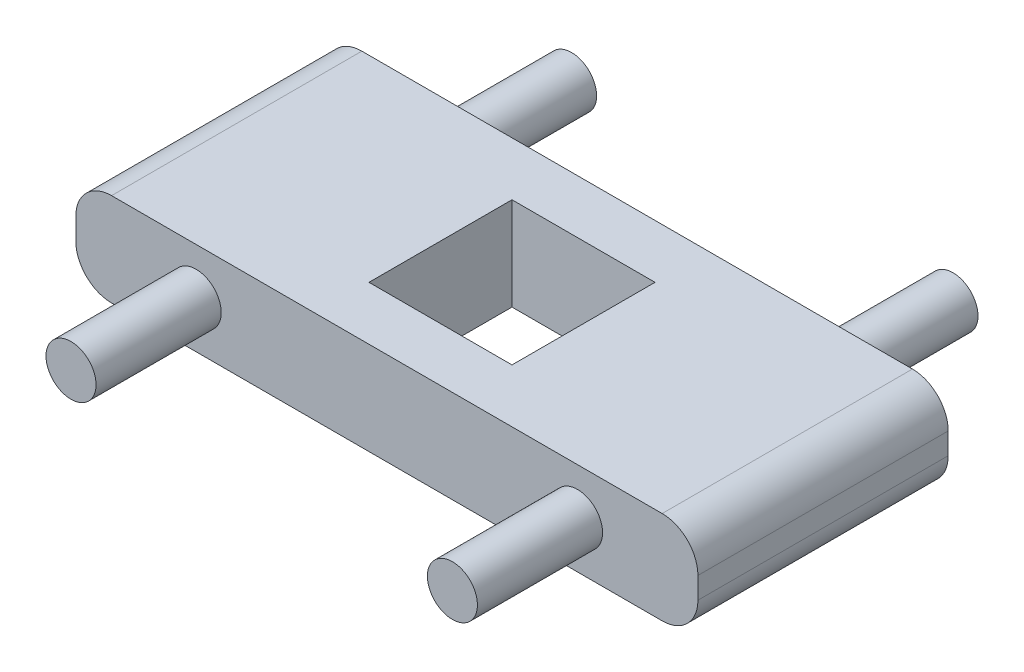
ISO-10303-21;
HEADER;
FILE_DESCRIPTION(('STEP AP214'),'2;1');
FILE_NAME('part.step','',(''),(''),'','','');
FILE_SCHEMA(('AUTOMOTIVE_DESIGN { 1 0 10303 214 1 1 1 1 }'));
ENDSEC;
DATA;
#1=APPLICATION_CONTEXT('core data for automotive mechanical design processes');
#2=APPLICATION_PROTOCOL_DEFINITION('international standard','automotive_design',2000,#1);
#3=PRODUCT_CONTEXT('',#1,'mechanical');
#4=PRODUCT('Part','Part','',(#3));
#5=PRODUCT_RELATED_PRODUCT_CATEGORY('part','',(#4));
#6=PRODUCT_DEFINITION_FORMATION('','',#4);
#7=PRODUCT_DEFINITION_CONTEXT('part definition',#1,'design');
#8=PRODUCT_DEFINITION('design','',#6,#7);
#9=PRODUCT_DEFINITION_SHAPE('','',#8);
#10=(LENGTH_UNIT() NAMED_UNIT(*) SI_UNIT(.MILLI.,.METRE.));
#11=(NAMED_UNIT(*) PLANE_ANGLE_UNIT() SI_UNIT($,.RADIAN.));
#12=(NAMED_UNIT(*) SI_UNIT($,.STERADIAN.) SOLID_ANGLE_UNIT());
#13=UNCERTAINTY_MEASURE_WITH_UNIT(LENGTH_MEASURE(1.E-05),#10,'distance_accuracy_value','');
#14=(GEOMETRIC_REPRESENTATION_CONTEXT(3) GLOBAL_UNCERTAINTY_ASSIGNED_CONTEXT((#13)) GLOBAL_UNIT_ASSIGNED_CONTEXT((#10,
#11,#12)) REPRESENTATION_CONTEXT('',''));
#15=CARTESIAN_POINT('',(0.,0.,0.));
#16=DIRECTION('',(0.,0.,1.));
#17=DIRECTION('',(1.,0.,0.));
#18=AXIS2_PLACEMENT_3D('',#15,#16,#17);
#19=CARTESIAN_POINT('',(0.,8.255,0.));
#20=DIRECTION('',(0.,-1.,0.));
#21=DIRECTION('',(0.,0.,-1.));
#22=AXIS2_PLACEMENT_3D('',#19,#20,#21);
#23=PLANE('',#22);
#24=DIRECTION('',(-1.,0.,0.));
#25=VECTOR('',#24,1.);
#26=CARTESIAN_POINT('',(-55.245,8.255,-22.225));
#27=LINE('',#26,#25);
#28=CARTESIAN_POINT('',(48.895,8.255,-22.225));
#29=VERTEX_POINT('',#28);
#30=CARTESIAN_POINT('',(-48.895,8.255,-22.225));
#31=VERTEX_POINT('',#30);
#32=EDGE_CURVE('E174',#29,#31,#27,.T.);
#33=ORIENTED_EDGE('',*,*,#32,.T.);
#34=DIRECTION('',(0.,0.,1.));
#35=VECTOR('',#34,1.);
#36=CARTESIAN_POINT('',(-48.895,8.255,0.));
#37=LINE('',#36,#35);
#38=CARTESIAN_POINT('',(-48.895,8.255,22.225));
#39=VERTEX_POINT('',#38);
#40=EDGE_CURVE('E222',#31,#39,#37,.T.);
#41=ORIENTED_EDGE('',*,*,#40,.T.);
#42=DIRECTION('',(1.,0.,0.));
#43=VECTOR('',#42,1.);
#44=CARTESIAN_POINT('',(-55.245,8.255,22.225));
#45=LINE('',#44,#43);
#46=CARTESIAN_POINT('',(48.895,8.255,22.225));
#47=VERTEX_POINT('',#46);
#48=EDGE_CURVE('E177',#39,#47,#45,.T.);
#49=ORIENTED_EDGE('',*,*,#48,.T.);
#50=DIRECTION('',(0.,0.,-1.));
#51=VECTOR('',#50,1.);
#52=CARTESIAN_POINT('',(48.895,8.255,0.));
#53=LINE('',#52,#51);
#54=EDGE_CURVE('E219',#47,#29,#53,.T.);
#55=ORIENTED_EDGE('',*,*,#54,.T.);
#56=EDGE_LOOP('',(#33,#41,#49,#55));
#57=FACE_BOUND('',#56,.T.);
#58=DIRECTION('',(0.,0.,1.));
#59=VECTOR('',#58,1.);
#60=CARTESIAN_POINT('',(-12.7,8.255,-12.7));
#61=LINE('',#60,#59);
#62=CARTESIAN_POINT('',(-12.7,8.255,-12.7));
#63=VERTEX_POINT('',#62);
#64=CARTESIAN_POINT('',(-12.7,8.255,12.7));
#65=VERTEX_POINT('',#64);
#66=EDGE_CURVE('E131',#63,#65,#61,.T.);
#67=ORIENTED_EDGE('',*,*,#66,.F.);
#68=DIRECTION('',(-1.,0.,0.));
#69=VECTOR('',#68,1.);
#70=CARTESIAN_POINT('',(12.7,8.255,-12.7));
#71=LINE('',#70,#69);
#72=CARTESIAN_POINT('',(12.7,8.255,-12.7));
#73=VERTEX_POINT('',#72);
#74=EDGE_CURVE('E156',#73,#63,#71,.T.);
#75=ORIENTED_EDGE('',*,*,#74,.F.);
#76=DIRECTION('',(0.,0.,-1.));
#77=VECTOR('',#76,1.);
#78=CARTESIAN_POINT('',(12.7,8.255,-12.7));
#79=LINE('',#78,#77);
#80=CARTESIAN_POINT('',(12.7,8.255,12.7));
#81=VERTEX_POINT('',#80);
#82=EDGE_CURVE('E154',#81,#73,#79,.T.);
#83=ORIENTED_EDGE('',*,*,#82,.F.);
#84=DIRECTION('',(1.,0.,0.));
#85=VECTOR('',#84,1.);
#86=CARTESIAN_POINT('',(12.7,8.255,12.7));
#87=LINE('',#86,#85);
#88=EDGE_CURVE('E141',#65,#81,#87,.T.);
#89=ORIENTED_EDGE('',*,*,#88,.F.);
#90=EDGE_LOOP('',(#67,#75,#83,#89));
#91=FACE_BOUND('',#90,.T.);
#92=ADVANCED_FACE('F39',(#57,#91),#23,.F.);
#93=CARTESIAN_POINT('',(0.,-8.255,0.));
#94=DIRECTION('',(0.,-1.,0.));
#95=DIRECTION('',(0.,0.,-1.));
#96=AXIS2_PLACEMENT_3D('',#93,#94,#95);
#97=PLANE('',#96);
#98=DIRECTION('',(1.,0.,0.));
#99=VECTOR('',#98,1.);
#100=CARTESIAN_POINT('',(-55.245,-8.255,22.225));
#101=LINE('',#100,#99);
#102=CARTESIAN_POINT('',(-48.895,-8.255,22.225));
#103=VERTEX_POINT('',#102);
#104=CARTESIAN_POINT('',(48.895,-8.255,22.225));
#105=VERTEX_POINT('',#104);
#106=EDGE_CURVE('E178',#103,#105,#101,.T.);
#107=ORIENTED_EDGE('',*,*,#106,.F.);
#108=DIRECTION('',(0.,0.,1.));
#109=VECTOR('',#108,1.);
#110=CARTESIAN_POINT('',(-48.895,-8.255,-22.225));
#111=LINE('',#110,#109);
#112=CARTESIAN_POINT('',(-48.895,-8.255,-22.225));
#113=VERTEX_POINT('',#112);
#114=EDGE_CURVE('E211',#103,#113,#111,.F.);
#115=ORIENTED_EDGE('',*,*,#114,.T.);
#116=DIRECTION('',(-1.,0.,0.));
#117=VECTOR('',#116,1.);
#118=CARTESIAN_POINT('',(-55.245,-8.255,-22.225));
#119=LINE('',#118,#117);
#120=CARTESIAN_POINT('',(48.895,-8.255,-22.225));
#121=VERTEX_POINT('',#120);
#122=EDGE_CURVE('E149',#121,#113,#119,.T.);
#123=ORIENTED_EDGE('',*,*,#122,.F.);
#124=DIRECTION('',(0.,0.,-1.));
#125=VECTOR('',#124,1.);
#126=CARTESIAN_POINT('',(48.895,-8.255,22.225));
#127=LINE('',#126,#125);
#128=EDGE_CURVE('E209',#121,#105,#127,.F.);
#129=ORIENTED_EDGE('',*,*,#128,.T.);
#130=EDGE_LOOP('',(#107,#115,#123,#129));
#131=FACE_BOUND('',#130,.T.);
#132=DIRECTION('',(-1.,0.,0.));
#133=VECTOR('',#132,1.);
#134=CARTESIAN_POINT('',(12.7,-8.255,-12.7));
#135=LINE('',#134,#133);
#136=CARTESIAN_POINT('',(12.7,-8.255,-12.7));
#137=VERTEX_POINT('',#136);
#138=CARTESIAN_POINT('',(-12.7,-8.255,-12.7));
#139=VERTEX_POINT('',#138);
#140=EDGE_CURVE('E142',#137,#139,#135,.T.);
#141=ORIENTED_EDGE('',*,*,#140,.T.);
#142=DIRECTION('',(0.,0.,1.));
#143=VECTOR('',#142,1.);
#144=CARTESIAN_POINT('',(-12.7,-8.255,-12.7));
#145=LINE('',#144,#143);
#146=CARTESIAN_POINT('',(-12.7,-8.255,12.7));
#147=VERTEX_POINT('',#146);
#148=EDGE_CURVE('E161',#139,#147,#145,.T.);
#149=ORIENTED_EDGE('',*,*,#148,.T.);
#150=DIRECTION('',(1.,0.,0.));
#151=VECTOR('',#150,1.);
#152=CARTESIAN_POINT('',(12.7,-8.255,12.7));
#153=LINE('',#152,#151);
#154=CARTESIAN_POINT('',(12.7,-8.255,12.7));
#155=VERTEX_POINT('',#154);
#156=EDGE_CURVE('E148',#147,#155,#153,.T.);
#157=ORIENTED_EDGE('',*,*,#156,.T.);
#158=DIRECTION('',(0.,0.,-1.));
#159=VECTOR('',#158,1.);
#160=CARTESIAN_POINT('',(12.7,-8.255,-12.7));
#161=LINE('',#160,#159);
#162=EDGE_CURVE('E165',#155,#137,#161,.T.);
#163=ORIENTED_EDGE('',*,*,#162,.T.);
#164=EDGE_LOOP('',(#141,#149,#157,#163));
#165=FACE_BOUND('',#164,.T.);
#166=ADVANCED_FACE('F273',(#131,#165),#97,.T.);
#167=CARTESIAN_POINT('',(55.245,8.255,22.225));
#168=DIRECTION('',(-1.,0.,0.));
#169=DIRECTION('',(0.,0.,1.));
#170=AXIS2_PLACEMENT_3D('',#167,#168,#169);
#171=PLANE('',#170);
#172=DIRECTION('',(0.,-1.,0.));
#173=VECTOR('',#172,1.);
#174=CARTESIAN_POINT('',(55.245,8.255,-22.225));
#175=LINE('',#174,#173);
#176=CARTESIAN_POINT('',(55.245,1.905,-22.225));
#177=VERTEX_POINT('',#176);
#178=CARTESIAN_POINT('',(55.245,-1.905,-22.225));
#179=VERTEX_POINT('',#178);
#180=EDGE_CURVE('E194',#177,#179,#175,.T.);
#181=ORIENTED_EDGE('',*,*,#180,.F.);
#182=DIRECTION('',(0.,0.,-1.));
#183=VECTOR('',#182,1.);
#184=CARTESIAN_POINT('',(55.245,1.905,22.225));
#185=LINE('',#184,#183);
#186=CARTESIAN_POINT('',(55.245,1.905,22.225));
#187=VERTEX_POINT('',#186);
#188=EDGE_CURVE('E227',#177,#187,#185,.F.);
#189=ORIENTED_EDGE('',*,*,#188,.T.);
#190=DIRECTION('',(0.,-1.,0.));
#191=VECTOR('',#190,1.);
#192=CARTESIAN_POINT('',(55.245,8.255,22.225));
#193=LINE('',#192,#191);
#194=CARTESIAN_POINT('',(55.245,-1.905,22.225));
#195=VERTEX_POINT('',#194);
#196=EDGE_CURVE('E181',#187,#195,#193,.T.);
#197=ORIENTED_EDGE('',*,*,#196,.T.);
#198=DIRECTION('',(0.,0.,-1.));
#199=VECTOR('',#198,1.);
#200=CARTESIAN_POINT('',(55.245,-1.905,-22.225));
#201=LINE('',#200,#199);
#202=EDGE_CURVE('E225',#195,#179,#201,.T.);
#203=ORIENTED_EDGE('',*,*,#202,.T.);
#204=EDGE_LOOP('',(#181,#189,#197,#203));
#205=FACE_BOUND('',#204,.T.);
#206=ADVANCED_FACE('F242',(#205),#171,.F.);
#207=CARTESIAN_POINT('',(-55.245,8.255,-22.225));
#208=DIRECTION('',(0.,0.,1.));
#209=DIRECTION('',(1.,0.,0.));
#210=AXIS2_PLACEMENT_3D('',#207,#208,#209);
#211=PLANE('',#210);
#212=CARTESIAN_POINT('',(-33.8666666666667,0.,-22.225));
#213=DIRECTION('',(0.,0.,1.));
#214=DIRECTION('',(1.,0.,0.));
#215=AXIS2_PLACEMENT_3D('',#212,#213,#214);
#216=CIRCLE('',#215,4.445);
#217=CARTESIAN_POINT('',(-29.4216666666667,0.,-22.225));
#218=VERTEX_POINT('',#217);
#219=EDGE_CURVE('E11',#218,#218,#216,.F.);
#220=ORIENTED_EDGE('',*,*,#219,.F.);
#221=EDGE_LOOP('',(#220));
#222=FACE_BOUND('',#221,.T.);
#223=CARTESIAN_POINT('',(33.8666666666667,0.,-22.225));
#224=DIRECTION('',(0.,0.,1.));
#225=DIRECTION('',(1.,0.,0.));
#226=AXIS2_PLACEMENT_3D('',#223,#224,#225);
#227=CIRCLE('',#226,4.445);
#228=CARTESIAN_POINT('',(38.3116666666667,0.,-22.225));
#229=VERTEX_POINT('',#228);
#230=EDGE_CURVE('E47',#229,#229,#227,.F.);
#231=ORIENTED_EDGE('',*,*,#230,.F.);
#232=EDGE_LOOP('',(#231));
#233=FACE_BOUND('',#232,.T.);
#234=ORIENTED_EDGE('',*,*,#122,.T.);
#235=CARTESIAN_POINT('',(-48.895,-1.905,-22.225));
#236=DIRECTION('',(0.,0.,1.));
#237=DIRECTION('',(1.,0.,0.));
#238=AXIS2_PLACEMENT_3D('',#235,#236,#237);
#239=CIRCLE('',#238,6.35);
#240=CARTESIAN_POINT('',(-55.245,-1.905,-22.225));
#241=VERTEX_POINT('',#240);
#242=EDGE_CURVE('E217',#113,#241,#239,.F.);
#243=ORIENTED_EDGE('',*,*,#242,.T.);
#244=DIRECTION('',(0.,-1.,0.));
#245=VECTOR('',#244,1.);
#246=CARTESIAN_POINT('',(-55.245,8.255,-22.225));
#247=LINE('',#246,#245);
#248=CARTESIAN_POINT('',(-55.245,1.905,-22.225));
#249=VERTEX_POINT('',#248);
#250=EDGE_CURVE('E191',#249,#241,#247,.T.);
#251=ORIENTED_EDGE('',*,*,#250,.F.);
#252=CARTESIAN_POINT('',(-48.895,1.905,-22.225));
#253=DIRECTION('',(0.,0.,1.));
#254=DIRECTION('',(1.,0.,0.));
#255=AXIS2_PLACEMENT_3D('',#252,#253,#254);
#256=CIRCLE('',#255,6.35);
#257=EDGE_CURVE('E215',#249,#31,#256,.F.);
#258=ORIENTED_EDGE('',*,*,#257,.T.);
#259=ORIENTED_EDGE('',*,*,#32,.F.);
#260=CARTESIAN_POINT('',(48.895,1.905,-22.225));
#261=DIRECTION('',(0.,0.,1.));
#262=DIRECTION('',(1.,0.,0.));
#263=AXIS2_PLACEMENT_3D('',#260,#261,#262);
#264=CIRCLE('',#263,6.35);
#265=EDGE_CURVE('E62',#29,#177,#264,.F.);
#266=ORIENTED_EDGE('',*,*,#265,.T.);
#267=ORIENTED_EDGE('',*,*,#180,.T.);
#268=CARTESIAN_POINT('',(48.895,-1.905,-22.225));
#269=DIRECTION('',(0.,0.,1.));
#270=DIRECTION('',(1.,0.,0.));
#271=AXIS2_PLACEMENT_3D('',#268,#269,#270);
#272=CIRCLE('',#271,6.35);
#273=EDGE_CURVE('E54',#179,#121,#272,.F.);
#274=ORIENTED_EDGE('',*,*,#273,.T.);
#275=EDGE_LOOP('',(#234,#243,#251,#258,#259,#266,#267,#274));
#276=FACE_BOUND('',#275,.T.);
#277=ADVANCED_FACE('F239',(#222,#233,#276),#211,.F.);
#278=CARTESIAN_POINT('',(-55.245,8.255,22.225));
#279=DIRECTION('',(1.,0.,0.));
#280=DIRECTION('',(0.,0.,-1.));
#281=AXIS2_PLACEMENT_3D('',#278,#279,#280);
#282=PLANE('',#281);
#283=ORIENTED_EDGE('',*,*,#250,.T.);
#284=DIRECTION('',(0.,0.,1.));
#285=VECTOR('',#284,1.);
#286=CARTESIAN_POINT('',(-55.245,-1.905,22.225));
#287=LINE('',#286,#285);
#288=CARTESIAN_POINT('',(-55.245,-1.905,22.225));
#289=VERTEX_POINT('',#288);
#290=EDGE_CURVE('E198',#241,#289,#287,.T.);
#291=ORIENTED_EDGE('',*,*,#290,.T.);
#292=DIRECTION('',(0.,-1.,0.));
#293=VECTOR('',#292,1.);
#294=CARTESIAN_POINT('',(-55.245,8.255,22.225));
#295=LINE('',#294,#293);
#296=CARTESIAN_POINT('',(-55.245,1.905,22.225));
#297=VERTEX_POINT('',#296);
#298=EDGE_CURVE('E188',#297,#289,#295,.T.);
#299=ORIENTED_EDGE('',*,*,#298,.F.);
#300=DIRECTION('',(0.,0.,1.));
#301=VECTOR('',#300,1.);
#302=CARTESIAN_POINT('',(-55.245,1.905,22.225));
#303=LINE('',#302,#301);
#304=EDGE_CURVE('E196',#297,#249,#303,.F.);
#305=ORIENTED_EDGE('',*,*,#304,.T.);
#306=EDGE_LOOP('',(#283,#291,#299,#305));
#307=FACE_BOUND('',#306,.T.);
#308=ADVANCED_FACE('F241',(#307),#282,.F.);
#309=CARTESIAN_POINT('',(-55.245,8.255,22.225));
#310=DIRECTION('',(0.,0.,-1.));
#311=DIRECTION('',(-1.,0.,0.));
#312=AXIS2_PLACEMENT_3D('',#309,#310,#311);
#313=PLANE('',#312);
#314=CARTESIAN_POINT('',(33.8666666666667,0.,22.225));
#315=DIRECTION('',(0.,0.,-1.));
#316=DIRECTION('',(-1.,0.,0.));
#317=AXIS2_PLACEMENT_3D('',#314,#315,#316);
#318=CIRCLE('',#317,4.445);
#319=CARTESIAN_POINT('',(29.4216666666667,0.,22.225));
#320=VERTEX_POINT('',#319);
#321=EDGE_CURVE('E232',#320,#320,#318,.F.);
#322=ORIENTED_EDGE('',*,*,#321,.F.);
#323=EDGE_LOOP('',(#322));
#324=FACE_BOUND('',#323,.T.);
#325=CARTESIAN_POINT('',(-33.8666666666667,0.,22.225));
#326=DIRECTION('',(0.,0.,-1.));
#327=DIRECTION('',(-1.,0.,0.));
#328=AXIS2_PLACEMENT_3D('',#325,#326,#327);
#329=CIRCLE('',#328,4.445);
#330=CARTESIAN_POINT('',(-38.3116666666667,0.,22.225));
#331=VERTEX_POINT('',#330);
#332=EDGE_CURVE('E229',#331,#331,#329,.F.);
#333=ORIENTED_EDGE('',*,*,#332,.F.);
#334=EDGE_LOOP('',(#333));
#335=FACE_BOUND('',#334,.T.);
#336=ORIENTED_EDGE('',*,*,#298,.T.);
#337=CARTESIAN_POINT('',(-48.895,-1.905,22.225));
#338=DIRECTION('',(0.,0.,-1.));
#339=DIRECTION('',(-1.,0.,0.));
#340=AXIS2_PLACEMENT_3D('',#337,#338,#339);
#341=CIRCLE('',#340,6.35);
#342=EDGE_CURVE('E207',#289,#103,#341,.F.);
#343=ORIENTED_EDGE('',*,*,#342,.T.);
#344=ORIENTED_EDGE('',*,*,#106,.T.);
#345=CARTESIAN_POINT('',(48.895,-1.905,22.225));
#346=DIRECTION('',(0.,0.,-1.));
#347=DIRECTION('',(-1.,0.,0.));
#348=AXIS2_PLACEMENT_3D('',#345,#346,#347);
#349=CIRCLE('',#348,6.35);
#350=EDGE_CURVE('E201',#105,#195,#349,.F.);
#351=ORIENTED_EDGE('',*,*,#350,.T.);
#352=ORIENTED_EDGE('',*,*,#196,.F.);
#353=CARTESIAN_POINT('',(48.895,1.905,22.225));
#354=DIRECTION('',(0.,0.,-1.));
#355=DIRECTION('',(-1.,0.,0.));
#356=AXIS2_PLACEMENT_3D('',#353,#354,#355);
#357=CIRCLE('',#356,6.35);
#358=EDGE_CURVE('E203',#187,#47,#357,.F.);
#359=ORIENTED_EDGE('',*,*,#358,.T.);
#360=ORIENTED_EDGE('',*,*,#48,.F.);
#361=CARTESIAN_POINT('',(-48.895,1.905,22.225));
#362=DIRECTION('',(0.,0.,-1.));
#363=DIRECTION('',(-1.,0.,0.));
#364=AXIS2_PLACEMENT_3D('',#361,#362,#363);
#365=CIRCLE('',#364,6.35);
#366=EDGE_CURVE('E205',#39,#297,#365,.F.);
#367=ORIENTED_EDGE('',*,*,#366,.T.);
#368=EDGE_LOOP('',(#336,#343,#344,#351,#352,#359,#360,#367));
#369=FACE_BOUND('',#368,.T.);
#370=ADVANCED_FACE('F257',(#324,#335,#369),#313,.F.);
#371=CARTESIAN_POINT('',(-12.7,8.255,-12.7));
#372=DIRECTION('',(1.,0.,0.));
#373=DIRECTION('',(0.,0.,-1.));
#374=AXIS2_PLACEMENT_3D('',#371,#372,#373);
#375=PLANE('',#374);
#376=ORIENTED_EDGE('',*,*,#148,.F.);
#377=DIRECTION('',(0.,-1.,0.));
#378=VECTOR('',#377,1.);
#379=CARTESIAN_POINT('',(-12.7,8.255,-12.7));
#380=LINE('',#379,#378);
#381=EDGE_CURVE('E137',#63,#139,#380,.T.);
#382=ORIENTED_EDGE('',*,*,#381,.F.);
#383=ORIENTED_EDGE('',*,*,#66,.T.);
#384=DIRECTION('',(0.,-1.,0.));
#385=VECTOR('',#384,1.);
#386=CARTESIAN_POINT('',(-12.7,8.255,12.7));
#387=LINE('',#386,#385);
#388=EDGE_CURVE('E134',#65,#147,#387,.T.);
#389=ORIENTED_EDGE('',*,*,#388,.T.);
#390=EDGE_LOOP('',(#376,#382,#383,#389));
#391=FACE_BOUND('',#390,.T.);
#392=ADVANCED_FACE('F133',(#391),#375,.T.);
#393=CARTESIAN_POINT('',(12.7,8.255,12.7));
#394=DIRECTION('',(0.,0.,-1.));
#395=DIRECTION('',(-1.,0.,0.));
#396=AXIS2_PLACEMENT_3D('',#393,#394,#395);
#397=PLANE('',#396);
#398=ORIENTED_EDGE('',*,*,#156,.F.);
#399=ORIENTED_EDGE('',*,*,#388,.F.);
#400=ORIENTED_EDGE('',*,*,#88,.T.);
#401=DIRECTION('',(0.,-1.,0.));
#402=VECTOR('',#401,1.);
#403=CARTESIAN_POINT('',(12.7,8.255,12.7));
#404=LINE('',#403,#402);
#405=EDGE_CURVE('E150',#81,#155,#404,.T.);
#406=ORIENTED_EDGE('',*,*,#405,.T.);
#407=EDGE_LOOP('',(#398,#399,#400,#406));
#408=FACE_BOUND('',#407,.T.);
#409=ADVANCED_FACE('F145',(#408),#397,.T.);
#410=CARTESIAN_POINT('',(12.7,8.255,-12.7));
#411=DIRECTION('',(-1.,0.,0.));
#412=DIRECTION('',(0.,0.,1.));
#413=AXIS2_PLACEMENT_3D('',#410,#411,#412);
#414=PLANE('',#413);
#415=ORIENTED_EDGE('',*,*,#162,.F.);
#416=ORIENTED_EDGE('',*,*,#405,.F.);
#417=ORIENTED_EDGE('',*,*,#82,.T.);
#418=DIRECTION('',(0.,-1.,0.));
#419=VECTOR('',#418,1.);
#420=CARTESIAN_POINT('',(12.7,8.255,-12.7));
#421=LINE('',#420,#419);
#422=EDGE_CURVE('E171',#73,#137,#421,.T.);
#423=ORIENTED_EDGE('',*,*,#422,.T.);
#424=EDGE_LOOP('',(#415,#416,#417,#423));
#425=FACE_BOUND('',#424,.T.);
#426=ADVANCED_FACE('F282',(#425),#414,.T.);
#427=CARTESIAN_POINT('',(12.7,8.255,-12.7));
#428=DIRECTION('',(0.,0.,1.));
#429=DIRECTION('',(1.,0.,0.));
#430=AXIS2_PLACEMENT_3D('',#427,#428,#429);
#431=PLANE('',#430);
#432=ORIENTED_EDGE('',*,*,#140,.F.);
#433=ORIENTED_EDGE('',*,*,#422,.F.);
#434=ORIENTED_EDGE('',*,*,#74,.T.);
#435=ORIENTED_EDGE('',*,*,#381,.T.);
#436=EDGE_LOOP('',(#432,#433,#434,#435));
#437=FACE_BOUND('',#436,.T.);
#438=ADVANCED_FACE('F280',(#437),#431,.T.);
#439=CARTESIAN_POINT('',(-48.895,-1.905,22.225));
#440=DIRECTION('',(0.,0.,-1.));
#441=DIRECTION('',(-1.,0.,0.));
#442=AXIS2_PLACEMENT_3D('',#439,#440,#441);
#443=CYLINDRICAL_SURFACE('',#442,6.35);
#444=ORIENTED_EDGE('',*,*,#242,.F.);
#445=ORIENTED_EDGE('',*,*,#114,.F.);
#446=ORIENTED_EDGE('',*,*,#342,.F.);
#447=ORIENTED_EDGE('',*,*,#290,.F.);
#448=EDGE_LOOP('',(#444,#445,#446,#447));
#449=FACE_BOUND('',#448,.T.);
#450=ADVANCED_FACE('F252',(#449),#443,.T.);
#451=CARTESIAN_POINT('',(-48.895,1.905,0.));
#452=DIRECTION('',(0.,0.,1.));
#453=DIRECTION('',(1.,0.,0.));
#454=AXIS2_PLACEMENT_3D('',#451,#452,#453);
#455=CYLINDRICAL_SURFACE('',#454,6.35);
#456=ORIENTED_EDGE('',*,*,#257,.F.);
#457=ORIENTED_EDGE('',*,*,#304,.F.);
#458=ORIENTED_EDGE('',*,*,#366,.F.);
#459=ORIENTED_EDGE('',*,*,#40,.F.);
#460=EDGE_LOOP('',(#456,#457,#458,#459));
#461=FACE_BOUND('',#460,.T.);
#462=ADVANCED_FACE('F263',(#461),#455,.T.);
#463=CARTESIAN_POINT('',(48.895,1.905,0.));
#464=DIRECTION('',(0.,0.,-1.));
#465=DIRECTION('',(-1.,0.,0.));
#466=AXIS2_PLACEMENT_3D('',#463,#464,#465);
#467=CYLINDRICAL_SURFACE('',#466,6.35);
#468=ORIENTED_EDGE('',*,*,#358,.F.);
#469=ORIENTED_EDGE('',*,*,#188,.F.);
#470=ORIENTED_EDGE('',*,*,#265,.F.);
#471=ORIENTED_EDGE('',*,*,#54,.F.);
#472=EDGE_LOOP('',(#468,#469,#470,#471));
#473=FACE_BOUND('',#472,.T.);
#474=ADVANCED_FACE('F268',(#473),#467,.T.);
#475=CARTESIAN_POINT('',(48.895,-1.905,22.225));
#476=DIRECTION('',(0.,0.,1.));
#477=DIRECTION('',(1.,0.,0.));
#478=AXIS2_PLACEMENT_3D('',#475,#476,#477);
#479=CYLINDRICAL_SURFACE('',#478,6.35);
#480=ORIENTED_EDGE('',*,*,#350,.F.);
#481=ORIENTED_EDGE('',*,*,#128,.F.);
#482=ORIENTED_EDGE('',*,*,#273,.F.);
#483=ORIENTED_EDGE('',*,*,#202,.F.);
#484=EDGE_LOOP('',(#480,#481,#482,#483));
#485=FACE_BOUND('',#484,.T.);
#486=ADVANCED_FACE('F41',(#485),#479,.T.);
#487=CARTESIAN_POINT('',(-33.8666666666667,0.,44.45));
#488=DIRECTION('',(0.,0.,-1.));
#489=DIRECTION('',(-1.,0.,0.));
#490=AXIS2_PLACEMENT_3D('',#487,#488,#489);
#491=CYLINDRICAL_SURFACE('',#490,4.445);
#492=CARTESIAN_POINT('',(-33.8666666666667,0.,44.45));
#493=DIRECTION('',(0.,0.,1.));
#494=DIRECTION('',(1.,0.,0.));
#495=AXIS2_PLACEMENT_3D('',#492,#493,#494);
#496=CIRCLE('',#495,4.445);
#497=CARTESIAN_POINT('',(-29.4216666666667,0.,44.45));
#498=VERTEX_POINT('',#497);
#499=EDGE_CURVE('E163',#498,#498,#496,.T.);
#500=ORIENTED_EDGE('',*,*,#499,.F.);
#501=EDGE_LOOP('',(#500));
#502=FACE_BOUND('',#501,.T.);
#503=ORIENTED_EDGE('',*,*,#332,.T.);
#504=EDGE_LOOP('',(#503));
#505=FACE_BOUND('',#504,.T.);
#506=ADVANCED_FACE('F311',(#502,#505),#491,.T.);
#507=CARTESIAN_POINT('',(-33.8666666666667,0.,44.45));
#508=DIRECTION('',(0.,0.,1.));
#509=DIRECTION('',(1.,0.,0.));
#510=AXIS2_PLACEMENT_3D('',#507,#508,#509);
#511=PLANE('',#510);
#512=ORIENTED_EDGE('',*,*,#499,.T.);
#513=EDGE_LOOP('',(#512));
#514=FACE_BOUND('',#513,.T.);
#515=ADVANCED_FACE('F315',(#514),#511,.T.);
#516=CARTESIAN_POINT('',(33.8666666666667,0.,44.45));
#517=DIRECTION('',(0.,0.,-1.));
#518=DIRECTION('',(-1.,0.,0.));
#519=AXIS2_PLACEMENT_3D('',#516,#517,#518);
#520=CYLINDRICAL_SURFACE('',#519,4.445);
#521=CARTESIAN_POINT('',(33.8666666666667,0.,44.45));
#522=DIRECTION('',(0.,0.,1.));
#523=DIRECTION('',(-1.,0.,0.));
#524=AXIS2_PLACEMENT_3D('',#521,#522,#523);
#525=CIRCLE('',#524,4.445);
#526=CARTESIAN_POINT('',(29.4216666666667,0.,44.45));
#527=VERTEX_POINT('',#526);
#528=EDGE_CURVE('E358',#527,#527,#525,.T.);
#529=ORIENTED_EDGE('',*,*,#528,.F.);
#530=EDGE_LOOP('',(#529));
#531=FACE_BOUND('',#530,.T.);
#532=ORIENTED_EDGE('',*,*,#321,.T.);
#533=EDGE_LOOP('',(#532));
#534=FACE_BOUND('',#533,.T.);
#535=ADVANCED_FACE('F321',(#531,#534),#520,.T.);
#536=CARTESIAN_POINT('',(33.8666666666667,0.,44.45));
#537=DIRECTION('',(0.,0.,-1.));
#538=DIRECTION('',(-1.,0.,0.));
#539=AXIS2_PLACEMENT_3D('',#536,#537,#538);
#540=PLANE('',#539);
#541=ORIENTED_EDGE('',*,*,#528,.T.);
#542=EDGE_LOOP('',(#541));
#543=FACE_BOUND('',#542,.T.);
#544=ADVANCED_FACE('F327',(#543),#540,.F.);
#545=CARTESIAN_POINT('',(33.8666666666667,0.,-44.45));
#546=DIRECTION('',(0.,0.,1.));
#547=DIRECTION('',(1.,0.,0.));
#548=AXIS2_PLACEMENT_3D('',#545,#546,#547);
#549=CYLINDRICAL_SURFACE('',#548,4.445);
#550=CARTESIAN_POINT('',(33.8666666666667,0.,-44.45));
#551=DIRECTION('',(0.,0.,-1.));
#552=DIRECTION('',(-1.,0.,0.));
#553=AXIS2_PLACEMENT_3D('',#550,#551,#552);
#554=CIRCLE('',#553,4.445);
#555=CARTESIAN_POINT('',(29.4216666666667,0.,-44.45));
#556=VERTEX_POINT('',#555);
#557=EDGE_CURVE('E355',#556,#556,#554,.T.);
#558=ORIENTED_EDGE('',*,*,#557,.F.);
#559=EDGE_LOOP('',(#558));
#560=FACE_BOUND('',#559,.T.);
#561=ORIENTED_EDGE('',*,*,#230,.T.);
#562=EDGE_LOOP('',(#561));
#563=FACE_BOUND('',#562,.T.);
#564=ADVANCED_FACE('F237',(#560,#563),#549,.T.);
#565=CARTESIAN_POINT('',(33.8666666666667,0.,-44.45));
#566=DIRECTION('',(0.,0.,-1.));
#567=DIRECTION('',(-1.,0.,0.));
#568=AXIS2_PLACEMENT_3D('',#565,#566,#567);
#569=PLANE('',#568);
#570=ORIENTED_EDGE('',*,*,#557,.T.);
#571=EDGE_LOOP('',(#570));
#572=FACE_BOUND('',#571,.T.);
#573=ADVANCED_FACE('F336',(#572),#569,.T.);
#574=CARTESIAN_POINT('',(-33.8666666666667,0.,-44.45));
#575=DIRECTION('',(0.,0.,1.));
#576=DIRECTION('',(1.,0.,0.));
#577=AXIS2_PLACEMENT_3D('',#574,#575,#576);
#578=CYLINDRICAL_SURFACE('',#577,4.445);
#579=CARTESIAN_POINT('',(-33.8666666666667,0.,-44.45));
#580=DIRECTION('',(0.,0.,-1.));
#581=DIRECTION('',(1.,0.,0.));
#582=AXIS2_PLACEMENT_3D('',#579,#580,#581);
#583=CIRCLE('',#582,4.445);
#584=CARTESIAN_POINT('',(-29.4216666666667,0.,-44.45));
#585=VERTEX_POINT('',#584);
#586=EDGE_CURVE('E353',#585,#585,#583,.T.);
#587=ORIENTED_EDGE('',*,*,#586,.F.);
#588=EDGE_LOOP('',(#587));
#589=FACE_BOUND('',#588,.T.);
#590=ORIENTED_EDGE('',*,*,#219,.T.);
#591=EDGE_LOOP('',(#590));
#592=FACE_BOUND('',#591,.T.);
#593=ADVANCED_FACE('F340',(#589,#592),#578,.T.);
#594=CARTESIAN_POINT('',(-33.8666666666667,0.,-44.45));
#595=DIRECTION('',(0.,0.,1.));
#596=DIRECTION('',(1.,0.,0.));
#597=AXIS2_PLACEMENT_3D('',#594,#595,#596);
#598=PLANE('',#597);
#599=ORIENTED_EDGE('',*,*,#586,.T.);
#600=EDGE_LOOP('',(#599));
#601=FACE_BOUND('',#600,.T.);
#602=ADVANCED_FACE('F342',(#601),#598,.F.);
#603=CLOSED_SHELL('',(#92,#166,#206,#277,#308,#370,#392,#409,#426,#438,#450,#462,#474,#486,#506,
#515,#535,#544,#564,#573,#593,#602));
#604=MANIFOLD_SOLID_BREP('B2',#603);
#605=ADVANCED_BREP_SHAPE_REPRESENTATION('',(#18,#604),#14);
#606=SHAPE_DEFINITION_REPRESENTATION(#9,#605);
ENDSEC;
END-ISO-10303-21;
